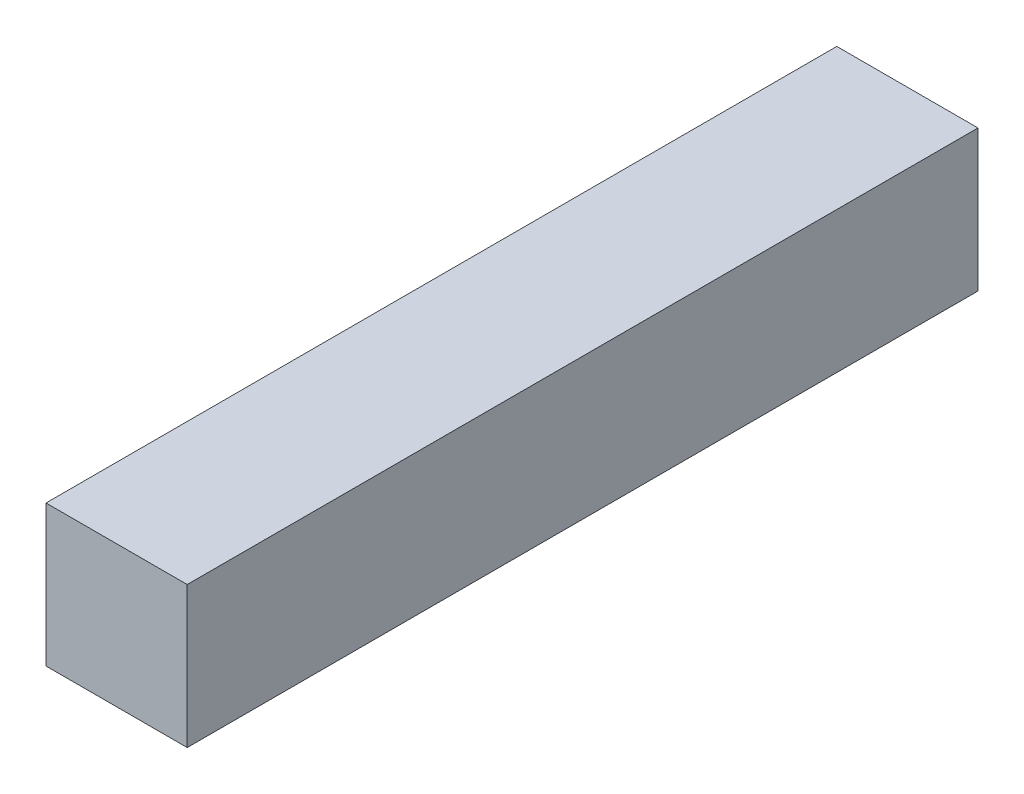
ISO-10303-21;
HEADER;
FILE_DESCRIPTION(('STEP AP214'),'2;1');
FILE_NAME('part.step','',(''),(''),'','','');
FILE_SCHEMA(('AUTOMOTIVE_DESIGN { 1 0 10303 214 1 1 1 1 }'));
ENDSEC;
DATA;
#1=APPLICATION_CONTEXT('core data for automotive mechanical design processes');
#2=APPLICATION_PROTOCOL_DEFINITION('international standard','automotive_design',2000,#1);
#3=PRODUCT_CONTEXT('',#1,'mechanical');
#4=PRODUCT('Part','Part','',(#3));
#5=PRODUCT_RELATED_PRODUCT_CATEGORY('part','',(#4));
#6=PRODUCT_DEFINITION_FORMATION('','',#4);
#7=PRODUCT_DEFINITION_CONTEXT('part definition',#1,'design');
#8=PRODUCT_DEFINITION('design','',#6,#7);
#9=PRODUCT_DEFINITION_SHAPE('','',#8);
#10=(LENGTH_UNIT() NAMED_UNIT(*) SI_UNIT(.MILLI.,.METRE.));
#11=(NAMED_UNIT(*) PLANE_ANGLE_UNIT() SI_UNIT($,.RADIAN.));
#12=(NAMED_UNIT(*) SI_UNIT($,.STERADIAN.) SOLID_ANGLE_UNIT());
#13=UNCERTAINTY_MEASURE_WITH_UNIT(LENGTH_MEASURE(1.E-05),#10,'distance_accuracy_value','');
#14=(GEOMETRIC_REPRESENTATION_CONTEXT(3) GLOBAL_UNCERTAINTY_ASSIGNED_CONTEXT((#13)) GLOBAL_UNIT_ASSIGNED_CONTEXT((#10,
#11,#12)) REPRESENTATION_CONTEXT('',''));
#15=CARTESIAN_POINT('',(0.,0.,0.));
#16=DIRECTION('',(0.,0.,1.));
#17=DIRECTION('',(1.,0.,0.));
#18=AXIS2_PLACEMENT_3D('',#15,#16,#17);
#19=CARTESIAN_POINT('',(0.,0.,17.78));
#20=DIRECTION('',(1.,0.,0.));
#21=DIRECTION('',(0.,1.,0.));
#22=AXIS2_PLACEMENT_3D('',#19,#20,#21);
#23=PLANE('',#22);
#24=DIRECTION('',(0.,-1.,0.));
#25=VECTOR('',#24,1.);
#26=CARTESIAN_POINT('',(0.,0.,0.));
#27=LINE('',#26,#25);
#28=CARTESIAN_POINT('',(0.,3.175,0.));
#29=VERTEX_POINT('',#28);
#30=CARTESIAN_POINT('',(0.,0.,0.));
#31=VERTEX_POINT('',#30);
#32=EDGE_CURVE('E96',#29,#31,#27,.T.);
#33=ORIENTED_EDGE('',*,*,#32,.T.);
#34=DIRECTION('',(0.,0.,-1.));
#35=VECTOR('',#34,1.);
#36=CARTESIAN_POINT('',(0.,0.,17.78));
#37=LINE('',#36,#35);
#38=CARTESIAN_POINT('',(0.,0.,17.78));
#39=VERTEX_POINT('',#38);
#40=EDGE_CURVE('E11',#39,#31,#37,.T.);
#41=ORIENTED_EDGE('',*,*,#40,.F.);
#42=DIRECTION('',(0.,-1.,0.));
#43=VECTOR('',#42,1.);
#44=CARTESIAN_POINT('',(0.,0.,17.78));
#45=LINE('',#44,#43);
#46=CARTESIAN_POINT('',(0.,3.175,17.78));
#47=VERTEX_POINT('',#46);
#48=EDGE_CURVE('E84',#47,#39,#45,.T.);
#49=ORIENTED_EDGE('',*,*,#48,.F.);
#50=DIRECTION('',(0.,0.,-1.));
#51=VECTOR('',#50,1.);
#52=CARTESIAN_POINT('',(0.,3.175,17.78));
#53=LINE('',#52,#51);
#54=EDGE_CURVE('E92',#47,#29,#53,.T.);
#55=ORIENTED_EDGE('',*,*,#54,.T.);
#56=EDGE_LOOP('',(#33,#41,#49,#55));
#57=FACE_BOUND('',#56,.T.);
#58=ADVANCED_FACE('F33',(#57),#23,.F.);
#59=CARTESIAN_POINT('',(0.,0.,17.78));
#60=DIRECTION('',(0.,1.,0.));
#61=DIRECTION('',(0.,0.,1.));
#62=AXIS2_PLACEMENT_3D('',#59,#60,#61);
#63=PLANE('',#62);
#64=DIRECTION('',(1.,0.,0.));
#65=VECTOR('',#64,1.);
#66=CARTESIAN_POINT('',(0.,0.,0.));
#67=LINE('',#66,#65);
#68=CARTESIAN_POINT('',(3.175,0.,0.));
#69=VERTEX_POINT('',#68);
#70=EDGE_CURVE('E88',#31,#69,#67,.T.);
#71=ORIENTED_EDGE('',*,*,#70,.T.);
#72=DIRECTION('',(0.,0.,-1.));
#73=VECTOR('',#72,1.);
#74=CARTESIAN_POINT('',(3.175,0.,17.78));
#75=LINE('',#74,#73);
#76=CARTESIAN_POINT('',(3.175,0.,17.78));
#77=VERTEX_POINT('',#76);
#78=EDGE_CURVE('E41',#77,#69,#75,.T.);
#79=ORIENTED_EDGE('',*,*,#78,.F.);
#80=DIRECTION('',(1.,0.,0.));
#81=VECTOR('',#80,1.);
#82=CARTESIAN_POINT('',(0.,0.,17.78));
#83=LINE('',#82,#81);
#84=EDGE_CURVE('E79',#39,#77,#83,.T.);
#85=ORIENTED_EDGE('',*,*,#84,.F.);
#86=ORIENTED_EDGE('',*,*,#40,.T.);
#87=EDGE_LOOP('',(#71,#79,#85,#86));
#88=FACE_BOUND('',#87,.T.);
#89=ADVANCED_FACE('F87',(#88),#63,.F.);
#90=CARTESIAN_POINT('',(3.175,0.,17.78));
#91=DIRECTION('',(-1.,0.,0.));
#92=DIRECTION('',(0.,-1.,0.));
#93=AXIS2_PLACEMENT_3D('',#90,#91,#92);
#94=PLANE('',#93);
#95=DIRECTION('',(0.,1.,0.));
#96=VECTOR('',#95,1.);
#97=CARTESIAN_POINT('',(3.175,0.,0.));
#98=LINE('',#97,#96);
#99=CARTESIAN_POINT('',(3.175,3.175,0.));
#100=VERTEX_POINT('',#99);
#101=EDGE_CURVE('E66',#69,#100,#98,.T.);
#102=ORIENTED_EDGE('',*,*,#101,.T.);
#103=DIRECTION('',(0.,0.,-1.));
#104=VECTOR('',#103,1.);
#105=CARTESIAN_POINT('',(3.175,3.175,17.78));
#106=LINE('',#105,#104);
#107=CARTESIAN_POINT('',(3.175,3.175,17.78));
#108=VERTEX_POINT('',#107);
#109=EDGE_CURVE('E89',#108,#100,#106,.T.);
#110=ORIENTED_EDGE('',*,*,#109,.F.);
#111=DIRECTION('',(0.,1.,0.));
#112=VECTOR('',#111,1.);
#113=CARTESIAN_POINT('',(3.175,0.,17.78));
#114=LINE('',#113,#112);
#115=EDGE_CURVE('E82',#77,#108,#114,.T.);
#116=ORIENTED_EDGE('',*,*,#115,.F.);
#117=ORIENTED_EDGE('',*,*,#78,.T.);
#118=EDGE_LOOP('',(#102,#110,#116,#117));
#119=FACE_BOUND('',#118,.T.);
#120=ADVANCED_FACE('F90',(#119),#94,.F.);
#121=CARTESIAN_POINT('',(0.,3.175,17.78));
#122=DIRECTION('',(0.,-1.,0.));
#123=DIRECTION('',(0.,0.,-1.));
#124=AXIS2_PLACEMENT_3D('',#121,#122,#123);
#125=PLANE('',#124);
#126=DIRECTION('',(-1.,0.,0.));
#127=VECTOR('',#126,1.);
#128=CARTESIAN_POINT('',(0.,3.175,0.));
#129=LINE('',#128,#127);
#130=EDGE_CURVE('E72',#100,#29,#129,.T.);
#131=ORIENTED_EDGE('',*,*,#130,.T.);
#132=ORIENTED_EDGE('',*,*,#54,.F.);
#133=DIRECTION('',(-1.,0.,0.));
#134=VECTOR('',#133,1.);
#135=CARTESIAN_POINT('',(0.,3.175,17.78));
#136=LINE('',#135,#134);
#137=EDGE_CURVE('E49',#108,#47,#136,.T.);
#138=ORIENTED_EDGE('',*,*,#137,.F.);
#139=ORIENTED_EDGE('',*,*,#109,.T.);
#140=EDGE_LOOP('',(#131,#132,#138,#139));
#141=FACE_BOUND('',#140,.T.);
#142=ADVANCED_FACE('F103',(#141),#125,.F.);
#143=CARTESIAN_POINT('',(0.,0.,17.78));
#144=DIRECTION('',(0.,0.,-1.));
#145=DIRECTION('',(-1.,0.,0.));
#146=AXIS2_PLACEMENT_3D('',#143,#144,#145);
#147=PLANE('',#146);
#148=ORIENTED_EDGE('',*,*,#48,.T.);
#149=ORIENTED_EDGE('',*,*,#84,.T.);
#150=ORIENTED_EDGE('',*,*,#115,.T.);
#151=ORIENTED_EDGE('',*,*,#137,.T.);
#152=EDGE_LOOP('',(#148,#149,#150,#151));
#153=FACE_BOUND('',#152,.T.);
#154=ADVANCED_FACE('F80',(#153),#147,.F.);
#155=CARTESIAN_POINT('',(0.,0.,0.));
#156=DIRECTION('',(0.,0.,-1.));
#157=DIRECTION('',(-1.,0.,0.));
#158=AXIS2_PLACEMENT_3D('',#155,#156,#157);
#159=PLANE('',#158);
#160=ORIENTED_EDGE('',*,*,#32,.F.);
#161=ORIENTED_EDGE('',*,*,#130,.F.);
#162=ORIENTED_EDGE('',*,*,#101,.F.);
#163=ORIENTED_EDGE('',*,*,#70,.F.);
#164=EDGE_LOOP('',(#160,#161,#162,#163));
#165=FACE_BOUND('',#164,.T.);
#166=ADVANCED_FACE('F106',(#165),#159,.T.);
#167=CLOSED_SHELL('',(#58,#89,#120,#142,#154,#166));
#168=MANIFOLD_SOLID_BREP('B2',#167);
#169=ADVANCED_BREP_SHAPE_REPRESENTATION('',(#18,#168),#14);
#170=SHAPE_DEFINITION_REPRESENTATION(#9,#169);
ENDSEC;
END-ISO-10303-21;
